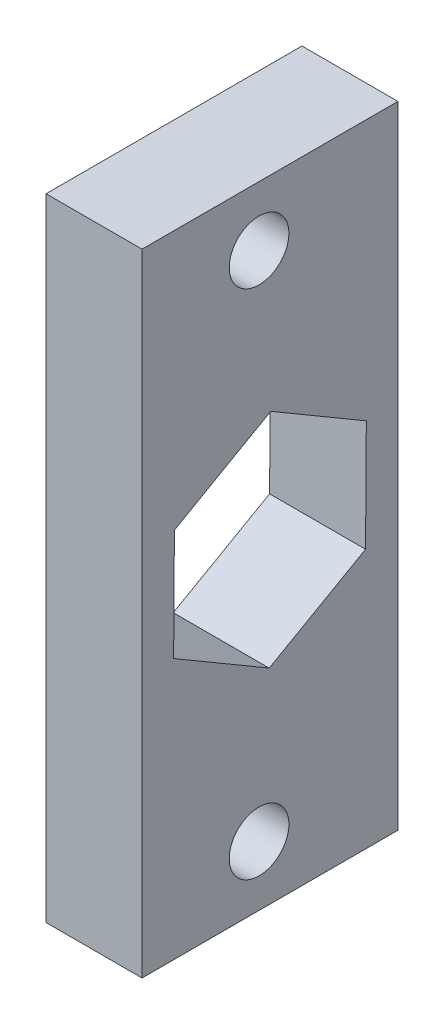
ISO-10303-21;
HEADER;
FILE_DESCRIPTION(('STEP AP214'),'2;1');
FILE_NAME('part.step','',(''),(''),'','','');
FILE_SCHEMA(('AUTOMOTIVE_DESIGN { 1 0 10303 214 1 1 1 1 }'));
ENDSEC;
DATA;
#1=APPLICATION_CONTEXT('core data for automotive mechanical design processes');
#2=APPLICATION_PROTOCOL_DEFINITION('international standard','automotive_design',2000,#1);
#3=PRODUCT_CONTEXT('',#1,'mechanical');
#4=PRODUCT('Part','Part','',(#3));
#5=PRODUCT_RELATED_PRODUCT_CATEGORY('part','',(#4));
#6=PRODUCT_DEFINITION_FORMATION('','',#4);
#7=PRODUCT_DEFINITION_CONTEXT('part definition',#1,'design');
#8=PRODUCT_DEFINITION('design','',#6,#7);
#9=PRODUCT_DEFINITION_SHAPE('','',#8);
#10=(LENGTH_UNIT() NAMED_UNIT(*) SI_UNIT(.MILLI.,.METRE.));
#11=(NAMED_UNIT(*) PLANE_ANGLE_UNIT() SI_UNIT($,.RADIAN.));
#12=(NAMED_UNIT(*) SI_UNIT($,.STERADIAN.) SOLID_ANGLE_UNIT());
#13=UNCERTAINTY_MEASURE_WITH_UNIT(LENGTH_MEASURE(1.E-05),#10,'distance_accuracy_value','');
#14=(GEOMETRIC_REPRESENTATION_CONTEXT(3) GLOBAL_UNCERTAINTY_ASSIGNED_CONTEXT((#13)) GLOBAL_UNIT_ASSIGNED_CONTEXT((#10,
#11,#12)) REPRESENTATION_CONTEXT('',''));
#15=CARTESIAN_POINT('',(0.,0.,0.));
#16=DIRECTION('',(0.,0.,1.));
#17=DIRECTION('',(1.,0.,0.));
#18=AXIS2_PLACEMENT_3D('',#15,#16,#17);
#19=CARTESIAN_POINT('',(6.,0.,0.));
#20=DIRECTION('',(1.,0.,0.));
#21=DIRECTION('',(0.,0.,-1.));
#22=AXIS2_PLACEMENT_3D('',#19,#20,#21);
#23=PLANE('',#22);
#24=CARTESIAN_POINT('',(6.,-16.,-10.6666666666667));
#25=DIRECTION('',(1.,0.,0.));
#26=DIRECTION('',(0.,0.,-1.));
#27=AXIS2_PLACEMENT_3D('',#24,#25,#26);
#28=CIRCLE('',#27,1.86666666666667);
#29=CARTESIAN_POINT('',(6.,-16.,-12.5333333333333));
#30=VERTEX_POINT('',#29);
#31=EDGE_CURVE('E150',#30,#30,#28,.T.);
#32=ORIENTED_EDGE('',*,*,#31,.F.);
#33=EDGE_LOOP('',(#32));
#34=FACE_BOUND('',#33,.T.);
#35=DIRECTION('',(0.,1.,0.));
#36=VECTOR('',#35,1.);
#37=CARTESIAN_POINT('',(6.,-19.7380477683154,-19.3495473274487));
#38=LINE('',#37,#36);
#39=CARTESIAN_POINT('',(6.,-19.7380477683154,-19.3495473274487));
#40=VERTEX_POINT('',#39);
#41=CARTESIAN_POINT('',(6.,19.7286188983512,-19.3495473274487));
#42=VERTEX_POINT('',#41);
#43=EDGE_CURVE('E170',#40,#42,#38,.T.);
#44=ORIENTED_EDGE('',*,*,#43,.T.);
#45=DIRECTION('',(0.,0.,1.));
#46=VECTOR('',#45,1.);
#47=CARTESIAN_POINT('',(6.,19.7286188983512,-19.3495473274487));
#48=LINE('',#47,#46);
#49=CARTESIAN_POINT('',(6.,19.7286188983512,-3.34954732744872));
#50=VERTEX_POINT('',#49);
#51=EDGE_CURVE('E173',#42,#50,#48,.T.);
#52=ORIENTED_EDGE('',*,*,#51,.T.);
#53=DIRECTION('',(0.,-1.,0.));
#54=VECTOR('',#53,1.);
#55=CARTESIAN_POINT('',(6.,19.7286188983512,-3.34954732744872));
#56=LINE('',#55,#54);
#57=CARTESIAN_POINT('',(6.,-19.7380477683154,-3.34954732744872));
#58=VERTEX_POINT('',#57);
#59=EDGE_CURVE('E176',#50,#58,#56,.T.);
#60=ORIENTED_EDGE('',*,*,#59,.T.);
#61=DIRECTION('',(0.,0.,-1.));
#62=VECTOR('',#61,1.);
#63=CARTESIAN_POINT('',(6.,-19.7380477683154,-3.34954732744872));
#64=LINE('',#63,#62);
#65=EDGE_CURVE('E178',#58,#40,#64,.T.);
#66=ORIENTED_EDGE('',*,*,#65,.T.);
#67=EDGE_LOOP('',(#44,#52,#60,#66));
#68=FACE_BOUND('',#67,.T.);
#69=DIRECTION('',(0.,0.505966762384238,0.862552975394794));
#70=VECTOR('',#69,1.);
#71=CARTESIAN_POINT('',(6.,3.41788313860538,-17.3733190569611));
#72=LINE('',#71,#70);
#73=CARTESIAN_POINT('',(6.,3.41788313860538,-17.3733190569611));
#74=VERTEX_POINT('',#73);
#75=CARTESIAN_POINT('',(6.,6.9233236961679,-11.3973767465472));
#76=VERTEX_POINT('',#75);
#77=EDGE_CURVE('E124',#74,#76,#72,.T.);
#78=ORIENTED_EDGE('',*,*,#77,.F.);
#79=DIRECTION('',(0.,0.999976169993864,-0.00690358199791782));
#80=VECTOR('',#79,1.);
#81=CARTESIAN_POINT('',(6.,-3.51015499254465,-17.3254896378627));
#82=LINE('',#81,#80);
#83=CARTESIAN_POINT('',(6.,-3.51015499254465,-17.3254896378627));
#84=VERTEX_POINT('',#83);
#85=EDGE_CURVE('E116',#84,#74,#82,.T.);
#86=ORIENTED_EDGE('',*,*,#85,.F.);
#87=DIRECTION('',(0.,0.494009407609626,-0.869456557392712));
#88=VECTOR('',#87,1.);
#89=CARTESIAN_POINT('',(6.,-6.93275256613215,-11.3017179083503));
#90=LINE('',#89,#88);
#91=CARTESIAN_POINT('',(6.,-6.93275256613215,-11.3017179083503));
#92=VERTEX_POINT('',#91);
#93=EDGE_CURVE('E147',#92,#84,#90,.T.);
#94=ORIENTED_EDGE('',*,*,#93,.F.);
#95=DIRECTION('',(0.,-0.505966762384238,-0.862552975394794));
#96=VECTOR('',#95,1.);
#97=CARTESIAN_POINT('',(6.,-3.42731200856964,-5.32577559793631));
#98=LINE('',#97,#96);
#99=CARTESIAN_POINT('',(6.,-3.42731200856964,-5.32577559793631));
#100=VERTEX_POINT('',#99);
#101=EDGE_CURVE('E145',#100,#92,#98,.T.);
#102=ORIENTED_EDGE('',*,*,#101,.F.);
#103=DIRECTION('',(0.,-0.999976169993864,0.0069035819979177));
#104=VECTOR('',#103,1.);
#105=CARTESIAN_POINT('',(6.,3.50072612258039,-5.37360501703475));
#106=LINE('',#105,#104);
#107=CARTESIAN_POINT('',(6.,3.50072612258039,-5.37360501703475));
#108=VERTEX_POINT('',#107);
#109=EDGE_CURVE('E140',#108,#100,#106,.T.);
#110=ORIENTED_EDGE('',*,*,#109,.F.);
#111=DIRECTION('',(0.,-0.494009407609627,0.869456557392712));
#112=VECTOR('',#111,1.);
#113=CARTESIAN_POINT('',(6.,6.9233236961679,-11.3973767465472));
#114=LINE('',#113,#112);
#115=EDGE_CURVE('E138',#76,#108,#114,.T.);
#116=ORIENTED_EDGE('',*,*,#115,.F.);
#117=EDGE_LOOP('',(#78,#86,#94,#102,#110,#116));
#118=FACE_BOUND('',#117,.T.);
#119=CARTESIAN_POINT('',(6.,16.,-10.6666666666667));
#120=DIRECTION('',(1.,0.,0.));
#121=DIRECTION('',(0.,0.,-1.));
#122=AXIS2_PLACEMENT_3D('',#119,#120,#121);
#123=CIRCLE('',#122,1.86666666666667);
#124=CARTESIAN_POINT('',(6.,16.,-12.5333333333333));
#125=VERTEX_POINT('',#124);
#126=EDGE_CURVE('E268',#125,#125,#123,.T.);
#127=ORIENTED_EDGE('',*,*,#126,.F.);
#128=EDGE_LOOP('',(#127));
#129=FACE_BOUND('',#128,.T.);
#130=ADVANCED_FACE('F39',(#34,#68,#118,#129),#23,.T.);
#131=CARTESIAN_POINT('',(0.,0.,0.));
#132=DIRECTION('',(1.,0.,0.));
#133=DIRECTION('',(0.,0.,-1.));
#134=AXIS2_PLACEMENT_3D('',#131,#132,#133);
#135=PLANE('',#134);
#136=DIRECTION('',(0.,1.,0.));
#137=VECTOR('',#136,1.);
#138=CARTESIAN_POINT('',(0.,-19.7380477683154,-19.3495473274487));
#139=LINE('',#138,#137);
#140=CARTESIAN_POINT('',(0.,-19.7380477683154,-19.3495473274487));
#141=VERTEX_POINT('',#140);
#142=CARTESIAN_POINT('',(0.,19.7286188983512,-19.3495473274487));
#143=VERTEX_POINT('',#142);
#144=EDGE_CURVE('E132',#141,#143,#139,.T.);
#145=ORIENTED_EDGE('',*,*,#144,.F.);
#146=DIRECTION('',(0.,0.,-1.));
#147=VECTOR('',#146,1.);
#148=CARTESIAN_POINT('',(0.,-19.7380477683154,-3.34954732744872));
#149=LINE('',#148,#147);
#150=CARTESIAN_POINT('',(0.,-19.7380477683154,-3.34954732744872));
#151=VERTEX_POINT('',#150);
#152=EDGE_CURVE('E174',#151,#141,#149,.T.);
#153=ORIENTED_EDGE('',*,*,#152,.F.);
#154=DIRECTION('',(0.,-1.,0.));
#155=VECTOR('',#154,1.);
#156=CARTESIAN_POINT('',(0.,19.7286188983512,-3.34954732744872));
#157=LINE('',#156,#155);
#158=CARTESIAN_POINT('',(0.,19.7286188983512,-3.34954732744872));
#159=VERTEX_POINT('',#158);
#160=EDGE_CURVE('E185',#159,#151,#157,.T.);
#161=ORIENTED_EDGE('',*,*,#160,.F.);
#162=DIRECTION('',(0.,0.,1.));
#163=VECTOR('',#162,1.);
#164=CARTESIAN_POINT('',(0.,19.7286188983512,-19.3495473274487));
#165=LINE('',#164,#163);
#166=EDGE_CURVE('E183',#143,#159,#165,.T.);
#167=ORIENTED_EDGE('',*,*,#166,.F.);
#168=EDGE_LOOP('',(#145,#153,#161,#167));
#169=FACE_BOUND('',#168,.T.);
#170=DIRECTION('',(0.,0.999976169993864,-0.00690358199791782));
#171=VECTOR('',#170,1.);
#172=CARTESIAN_POINT('',(0.,-3.51015499254465,-17.3254896378627));
#173=LINE('',#172,#171);
#174=CARTESIAN_POINT('',(0.,-3.51015499254465,-17.3254896378627));
#175=VERTEX_POINT('',#174);
#176=CARTESIAN_POINT('',(0.,3.41788313860538,-17.3733190569611));
#177=VERTEX_POINT('',#176);
#178=EDGE_CURVE('E62',#175,#177,#173,.T.);
#179=ORIENTED_EDGE('',*,*,#178,.T.);
#180=DIRECTION('',(0.,0.505966762384238,0.862552975394794));
#181=VECTOR('',#180,1.);
#182=CARTESIAN_POINT('',(0.,3.41788313860538,-17.3733190569611));
#183=LINE('',#182,#181);
#184=CARTESIAN_POINT('',(0.,6.9233236961679,-11.3973767465472));
#185=VERTEX_POINT('',#184);
#186=EDGE_CURVE('E131',#177,#185,#183,.T.);
#187=ORIENTED_EDGE('',*,*,#186,.T.);
#188=DIRECTION('',(0.,-0.494009407609627,0.869456557392712));
#189=VECTOR('',#188,1.);
#190=CARTESIAN_POINT('',(0.,6.9233236961679,-11.3973767465472));
#191=LINE('',#190,#189);
#192=CARTESIAN_POINT('',(0.,3.50072612258039,-5.37360501703475));
#193=VERTEX_POINT('',#192);
#194=EDGE_CURVE('E152',#185,#193,#191,.T.);
#195=ORIENTED_EDGE('',*,*,#194,.T.);
#196=DIRECTION('',(0.,-0.999976169993864,0.0069035819979177));
#197=VECTOR('',#196,1.);
#198=CARTESIAN_POINT('',(0.,3.50072612258039,-5.37360501703475));
#199=LINE('',#198,#197);
#200=CARTESIAN_POINT('',(0.,-3.42731200856964,-5.32577559793631));
#201=VERTEX_POINT('',#200);
#202=EDGE_CURVE('E155',#193,#201,#199,.T.);
#203=ORIENTED_EDGE('',*,*,#202,.T.);
#204=DIRECTION('',(0.,-0.505966762384238,-0.862552975394794));
#205=VECTOR('',#204,1.);
#206=CARTESIAN_POINT('',(0.,-3.42731200856964,-5.32577559793631));
#207=LINE('',#206,#205);
#208=CARTESIAN_POINT('',(0.,-6.93275256613215,-11.3017179083503));
#209=VERTEX_POINT('',#208);
#210=EDGE_CURVE('E158',#201,#209,#207,.T.);
#211=ORIENTED_EDGE('',*,*,#210,.T.);
#212=DIRECTION('',(0.,0.494009407609626,-0.869456557392712));
#213=VECTOR('',#212,1.);
#214=CARTESIAN_POINT('',(0.,-6.93275256613215,-11.3017179083503));
#215=LINE('',#214,#213);
#216=EDGE_CURVE('E125',#209,#175,#215,.T.);
#217=ORIENTED_EDGE('',*,*,#216,.T.);
#218=EDGE_LOOP('',(#179,#187,#195,#203,#211,#217));
#219=FACE_BOUND('',#218,.T.);
#220=CARTESIAN_POINT('',(0.,-16.,-10.6666666666667));
#221=DIRECTION('',(1.,0.,0.));
#222=DIRECTION('',(0.,0.,-1.));
#223=AXIS2_PLACEMENT_3D('',#220,#221,#222);
#224=CIRCLE('',#223,1.86666666666667);
#225=CARTESIAN_POINT('',(0.,-16.,-12.5333333333333));
#226=VERTEX_POINT('',#225);
#227=EDGE_CURVE('E274',#226,#226,#224,.T.);
#228=ORIENTED_EDGE('',*,*,#227,.T.);
#229=EDGE_LOOP('',(#228));
#230=FACE_BOUND('',#229,.T.);
#231=CARTESIAN_POINT('',(0.,16.,-10.6666666666667));
#232=DIRECTION('',(1.,0.,0.));
#233=DIRECTION('',(0.,0.,-1.));
#234=AXIS2_PLACEMENT_3D('',#231,#232,#233);
#235=CIRCLE('',#234,1.86666666666667);
#236=CARTESIAN_POINT('',(0.,16.,-12.5333333333333));
#237=VERTEX_POINT('',#236);
#238=EDGE_CURVE('E271',#237,#237,#235,.T.);
#239=ORIENTED_EDGE('',*,*,#238,.T.);
#240=EDGE_LOOP('',(#239));
#241=FACE_BOUND('',#240,.T.);
#242=ADVANCED_FACE('F203',(#169,#219,#230,#241),#135,.F.);
#243=CARTESIAN_POINT('',(6.,-19.7380477683154,-19.3495473274487));
#244=DIRECTION('',(0.,0.,1.));
#245=DIRECTION('',(1.,0.,0.));
#246=AXIS2_PLACEMENT_3D('',#243,#244,#245);
#247=PLANE('',#246);
#248=ORIENTED_EDGE('',*,*,#144,.T.);
#249=DIRECTION('',(-1.,0.,0.));
#250=VECTOR('',#249,1.);
#251=CARTESIAN_POINT('',(6.,19.7286188983512,-19.3495473274487));
#252=LINE('',#251,#250);
#253=EDGE_CURVE('E11',#42,#143,#252,.T.);
#254=ORIENTED_EDGE('',*,*,#253,.F.);
#255=ORIENTED_EDGE('',*,*,#43,.F.);
#256=DIRECTION('',(-1.,0.,0.));
#257=VECTOR('',#256,1.);
#258=CARTESIAN_POINT('',(6.,-19.7380477683154,-19.3495473274487));
#259=LINE('',#258,#257);
#260=EDGE_CURVE('E180',#40,#141,#259,.T.);
#261=ORIENTED_EDGE('',*,*,#260,.T.);
#262=EDGE_LOOP('',(#248,#254,#255,#261));
#263=FACE_BOUND('',#262,.T.);
#264=ADVANCED_FACE('F41',(#263),#247,.F.);
#265=CARTESIAN_POINT('',(6.,19.7286188983512,-19.3495473274487));
#266=DIRECTION('',(0.,-1.,0.));
#267=DIRECTION('',(0.,0.,-1.));
#268=AXIS2_PLACEMENT_3D('',#265,#266,#267);
#269=PLANE('',#268);
#270=ORIENTED_EDGE('',*,*,#166,.T.);
#271=DIRECTION('',(-1.,0.,0.));
#272=VECTOR('',#271,1.);
#273=CARTESIAN_POINT('',(6.,19.7286188983512,-3.34954732744872));
#274=LINE('',#273,#272);
#275=EDGE_CURVE('E47',#50,#159,#274,.T.);
#276=ORIENTED_EDGE('',*,*,#275,.F.);
#277=ORIENTED_EDGE('',*,*,#51,.F.);
#278=ORIENTED_EDGE('',*,*,#253,.T.);
#279=EDGE_LOOP('',(#270,#276,#277,#278));
#280=FACE_BOUND('',#279,.T.);
#281=ADVANCED_FACE('F213',(#280),#269,.F.);
#282=CARTESIAN_POINT('',(6.,19.7286188983512,-3.34954732744872));
#283=DIRECTION('',(0.,0.,-1.));
#284=DIRECTION('',(-1.,0.,0.));
#285=AXIS2_PLACEMENT_3D('',#282,#283,#284);
#286=PLANE('',#285);
#287=ORIENTED_EDGE('',*,*,#160,.T.);
#288=DIRECTION('',(-1.,0.,0.));
#289=VECTOR('',#288,1.);
#290=CARTESIAN_POINT('',(6.,-19.7380477683154,-3.34954732744872));
#291=LINE('',#290,#289);
#292=EDGE_CURVE('E190',#58,#151,#291,.T.);
#293=ORIENTED_EDGE('',*,*,#292,.F.);
#294=ORIENTED_EDGE('',*,*,#59,.F.);
#295=ORIENTED_EDGE('',*,*,#275,.T.);
#296=EDGE_LOOP('',(#287,#293,#294,#295));
#297=FACE_BOUND('',#296,.T.);
#298=ADVANCED_FACE('F197',(#297),#286,.F.);
#299=CARTESIAN_POINT('',(6.,-19.7380477683154,-3.34954732744872));
#300=DIRECTION('',(0.,1.,0.));
#301=DIRECTION('',(0.,0.,1.));
#302=AXIS2_PLACEMENT_3D('',#299,#300,#301);
#303=PLANE('',#302);
#304=ORIENTED_EDGE('',*,*,#152,.T.);
#305=ORIENTED_EDGE('',*,*,#260,.F.);
#306=ORIENTED_EDGE('',*,*,#65,.F.);
#307=ORIENTED_EDGE('',*,*,#292,.T.);
#308=EDGE_LOOP('',(#304,#305,#306,#307));
#309=FACE_BOUND('',#308,.T.);
#310=ADVANCED_FACE('F207',(#309),#303,.F.);
#311=CARTESIAN_POINT('',(6.,-3.51015499254465,-17.3254896378627));
#312=DIRECTION('',(0.,0.00690358199791782,0.999976169993864));
#313=DIRECTION('',(0.,-0.999976169993864,0.00690358199791782));
#314=AXIS2_PLACEMENT_3D('',#311,#312,#313);
#315=PLANE('',#314);
#316=ORIENTED_EDGE('',*,*,#178,.F.);
#317=DIRECTION('',(-1.,0.,0.));
#318=VECTOR('',#317,1.);
#319=CARTESIAN_POINT('',(6.,-3.51015499254465,-17.3254896378627));
#320=LINE('',#319,#318);
#321=EDGE_CURVE('E120',#84,#175,#320,.T.);
#322=ORIENTED_EDGE('',*,*,#321,.F.);
#323=ORIENTED_EDGE('',*,*,#85,.T.);
#324=DIRECTION('',(-1.,0.,0.));
#325=VECTOR('',#324,1.);
#326=CARTESIAN_POINT('',(6.,3.41788313860538,-17.3733190569611));
#327=LINE('',#326,#325);
#328=EDGE_CURVE('E119',#74,#177,#327,.T.);
#329=ORIENTED_EDGE('',*,*,#328,.T.);
#330=EDGE_LOOP('',(#316,#322,#323,#329));
#331=FACE_BOUND('',#330,.T.);
#332=ADVANCED_FACE('F118',(#331),#315,.T.);
#333=CARTESIAN_POINT('',(6.,3.41788313860538,-17.3733190569611));
#334=DIRECTION('',(0.,-0.862552975394794,0.505966762384238));
#335=DIRECTION('',(0.,-0.505966762384238,-0.862552975394794));
#336=AXIS2_PLACEMENT_3D('',#333,#334,#335);
#337=PLANE('',#336);
#338=ORIENTED_EDGE('',*,*,#186,.F.);
#339=ORIENTED_EDGE('',*,*,#328,.F.);
#340=ORIENTED_EDGE('',*,*,#77,.T.);
#341=DIRECTION('',(-1.,0.,0.));
#342=VECTOR('',#341,1.);
#343=CARTESIAN_POINT('',(6.,6.9233236961679,-11.3973767465472));
#344=LINE('',#343,#342);
#345=EDGE_CURVE('E133',#76,#185,#344,.T.);
#346=ORIENTED_EDGE('',*,*,#345,.T.);
#347=EDGE_LOOP('',(#338,#339,#340,#346));
#348=FACE_BOUND('',#347,.T.);
#349=ADVANCED_FACE('F128',(#348),#337,.T.);
#350=CARTESIAN_POINT('',(6.,6.9233236961679,-11.3973767465472));
#351=DIRECTION('',(0.,-0.869456557392712,-0.494009407609627));
#352=DIRECTION('',(0.,0.494009407609627,-0.869456557392712));
#353=AXIS2_PLACEMENT_3D('',#350,#351,#352);
#354=PLANE('',#353);
#355=ORIENTED_EDGE('',*,*,#194,.F.);
#356=ORIENTED_EDGE('',*,*,#345,.F.);
#357=ORIENTED_EDGE('',*,*,#115,.T.);
#358=DIRECTION('',(-1.,0.,0.));
#359=VECTOR('',#358,1.);
#360=CARTESIAN_POINT('',(6.,3.50072612258039,-5.37360501703475));
#361=LINE('',#360,#359);
#362=EDGE_CURVE('E167',#108,#193,#361,.T.);
#363=ORIENTED_EDGE('',*,*,#362,.T.);
#364=EDGE_LOOP('',(#355,#356,#357,#363));
#365=FACE_BOUND('',#364,.T.);
#366=ADVANCED_FACE('F238',(#365),#354,.T.);
#367=CARTESIAN_POINT('',(6.,3.50072612258039,-5.37360501703475));
#368=DIRECTION('',(0.,-0.0069035819979177,-0.999976169993864));
#369=DIRECTION('',(0.,0.999976169993865,-0.0069035819979177));
#370=AXIS2_PLACEMENT_3D('',#367,#368,#369);
#371=PLANE('',#370);
#372=ORIENTED_EDGE('',*,*,#202,.F.);
#373=ORIENTED_EDGE('',*,*,#362,.F.);
#374=ORIENTED_EDGE('',*,*,#109,.T.);
#375=DIRECTION('',(-1.,0.,0.));
#376=VECTOR('',#375,1.);
#377=CARTESIAN_POINT('',(6.,-3.42731200856964,-5.32577559793631));
#378=LINE('',#377,#376);
#379=EDGE_CURVE('E165',#100,#201,#378,.T.);
#380=ORIENTED_EDGE('',*,*,#379,.T.);
#381=EDGE_LOOP('',(#372,#373,#374,#380));
#382=FACE_BOUND('',#381,.T.);
#383=ADVANCED_FACE('F242',(#382),#371,.T.);
#384=CARTESIAN_POINT('',(6.,-3.42731200856964,-5.32577559793631));
#385=DIRECTION('',(0.,0.862552975394794,-0.505966762384238));
#386=DIRECTION('',(0.,0.505966762384238,0.862552975394794));
#387=AXIS2_PLACEMENT_3D('',#384,#385,#386);
#388=PLANE('',#387);
#389=ORIENTED_EDGE('',*,*,#210,.F.);
#390=ORIENTED_EDGE('',*,*,#379,.F.);
#391=ORIENTED_EDGE('',*,*,#101,.T.);
#392=DIRECTION('',(-1.,0.,0.));
#393=VECTOR('',#392,1.);
#394=CARTESIAN_POINT('',(6.,-6.93275256613215,-11.3017179083503));
#395=LINE('',#394,#393);
#396=EDGE_CURVE('E54',#92,#209,#395,.T.);
#397=ORIENTED_EDGE('',*,*,#396,.T.);
#398=EDGE_LOOP('',(#389,#390,#391,#397));
#399=FACE_BOUND('',#398,.T.);
#400=ADVANCED_FACE('F248',(#399),#388,.T.);
#401=CARTESIAN_POINT('',(6.,-6.93275256613215,-11.3017179083503));
#402=DIRECTION('',(0.,0.869456557392712,0.494009407609626));
#403=DIRECTION('',(0.,-0.494009407609626,0.869456557392712));
#404=AXIS2_PLACEMENT_3D('',#401,#402,#403);
#405=PLANE('',#404);
#406=ORIENTED_EDGE('',*,*,#216,.F.);
#407=ORIENTED_EDGE('',*,*,#396,.F.);
#408=ORIENTED_EDGE('',*,*,#93,.T.);
#409=ORIENTED_EDGE('',*,*,#321,.T.);
#410=EDGE_LOOP('',(#406,#407,#408,#409));
#411=FACE_BOUND('',#410,.T.);
#412=ADVANCED_FACE('F252',(#411),#405,.T.);
#413=CARTESIAN_POINT('',(6.,-16.,-10.6666666666667));
#414=DIRECTION('',(-1.,0.,0.));
#415=DIRECTION('',(0.,0.,1.));
#416=AXIS2_PLACEMENT_3D('',#413,#414,#415);
#417=CYLINDRICAL_SURFACE('',#416,1.86666666666667);
#418=ORIENTED_EDGE('',*,*,#31,.T.);
#419=EDGE_LOOP('',(#418));
#420=FACE_BOUND('',#419,.T.);
#421=ORIENTED_EDGE('',*,*,#227,.F.);
#422=EDGE_LOOP('',(#421));
#423=FACE_BOUND('',#422,.T.);
#424=ADVANCED_FACE('F256',(#420,#423),#417,.F.);
#425=CARTESIAN_POINT('',(6.,16.,-10.6666666666667));
#426=DIRECTION('',(-1.,0.,0.));
#427=DIRECTION('',(0.,0.,1.));
#428=AXIS2_PLACEMENT_3D('',#425,#426,#427);
#429=CYLINDRICAL_SURFACE('',#428,1.86666666666667);
#430=ORIENTED_EDGE('',*,*,#126,.T.);
#431=EDGE_LOOP('',(#430));
#432=FACE_BOUND('',#431,.T.);
#433=ORIENTED_EDGE('',*,*,#238,.F.);
#434=EDGE_LOOP('',(#433));
#435=FACE_BOUND('',#434,.T.);
#436=ADVANCED_FACE('F259',(#432,#435),#429,.F.);
#437=CLOSED_SHELL('',(#130,#242,#264,#281,#298,#310,#332,#349,#366,#383,#400,#412,#424,#436));
#438=MANIFOLD_SOLID_BREP('B2',#437);
#439=ADVANCED_BREP_SHAPE_REPRESENTATION('',(#18,#438),#14);
#440=SHAPE_DEFINITION_REPRESENTATION(#9,#439);
ENDSEC;
END-ISO-10303-21;
